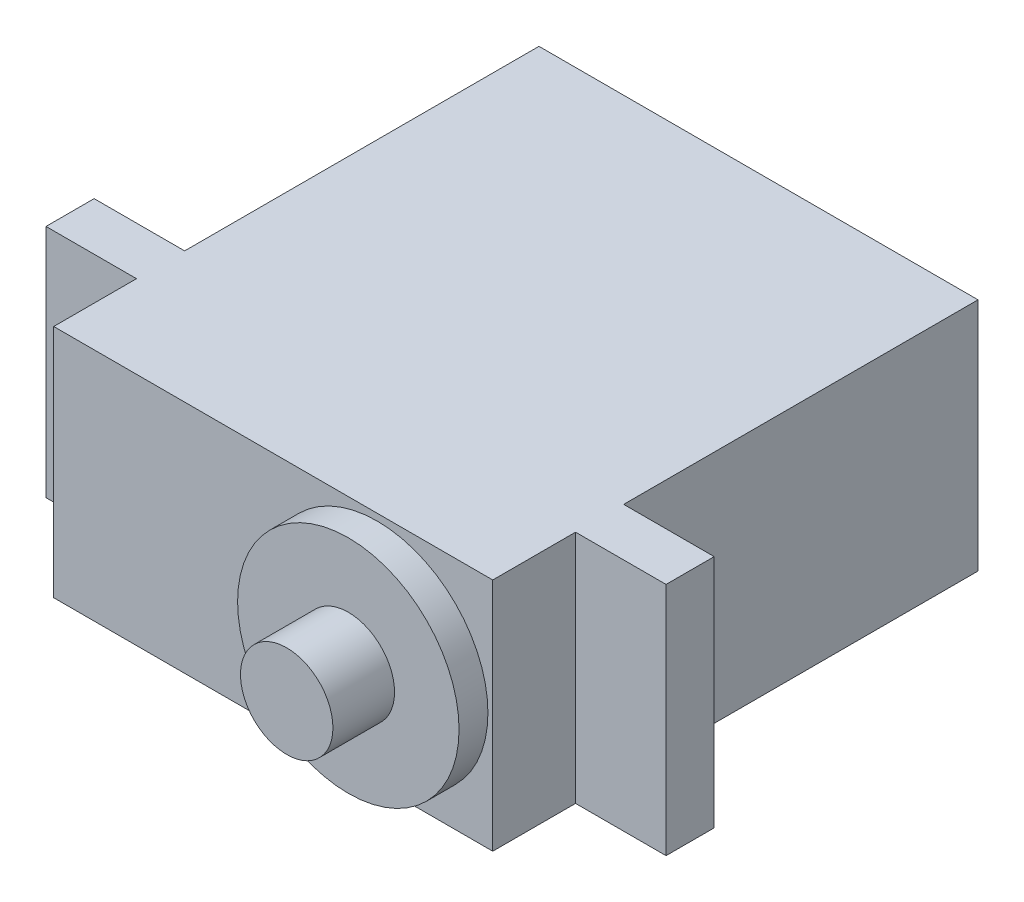
ISO-10303-21;
HEADER;
FILE_DESCRIPTION(('STEP AP214'),'2;1');
FILE_NAME('part.step','',(''),(''),'','','');
FILE_SCHEMA(('AUTOMOTIVE_DESIGN { 1 0 10303 214 1 1 1 1 }'));
ENDSEC;
DATA;
#1=APPLICATION_CONTEXT('core data for automotive mechanical design processes');
#2=APPLICATION_PROTOCOL_DEFINITION('international standard','automotive_design',2000,#1);
#3=PRODUCT_CONTEXT('',#1,'mechanical');
#4=PRODUCT('Part','Part','',(#3));
#5=PRODUCT_RELATED_PRODUCT_CATEGORY('part','',(#4));
#6=PRODUCT_DEFINITION_FORMATION('','',#4);
#7=PRODUCT_DEFINITION_CONTEXT('part definition',#1,'design');
#8=PRODUCT_DEFINITION('design','',#6,#7);
#9=PRODUCT_DEFINITION_SHAPE('','',#8);
#10=(LENGTH_UNIT() NAMED_UNIT(*) SI_UNIT(.MILLI.,.METRE.));
#11=(NAMED_UNIT(*) PLANE_ANGLE_UNIT() SI_UNIT($,.RADIAN.));
#12=(NAMED_UNIT(*) SI_UNIT($,.STERADIAN.) SOLID_ANGLE_UNIT());
#13=UNCERTAINTY_MEASURE_WITH_UNIT(LENGTH_MEASURE(1.E-05),#10,'distance_accuracy_value','');
#14=(GEOMETRIC_REPRESENTATION_CONTEXT(3) GLOBAL_UNCERTAINTY_ASSIGNED_CONTEXT((#13)) GLOBAL_UNIT_ASSIGNED_CONTEXT((#10,
#11,#12)) REPRESENTATION_CONTEXT('',''));
#15=CARTESIAN_POINT('',(0.,0.,0.));
#16=DIRECTION('',(0.,0.,1.));
#17=DIRECTION('',(1.,0.,0.));
#18=AXIS2_PLACEMENT_3D('',#15,#16,#17);
#19=CARTESIAN_POINT('',(0.,0.,9.));
#20=DIRECTION('',(0.,0.,1.));
#21=DIRECTION('',(1.,0.,0.));
#22=AXIS2_PLACEMENT_3D('',#19,#20,#21);
#23=PLANE('',#22);
#24=CARTESIAN_POINT('',(0.,0.,9.));
#25=DIRECTION('',(0.,0.,1.));
#26=DIRECTION('',(1.,0.,0.));
#27=AXIS2_PLACEMENT_3D('',#24,#25,#26);
#28=CIRCLE('',#27,2.4);
#29=CARTESIAN_POINT('',(2.4,0.,9.));
#30=VERTEX_POINT('',#29);
#31=EDGE_CURVE('E9',#30,#30,#28,.T.);
#32=ORIENTED_EDGE('',*,*,#31,.T.);
#33=EDGE_LOOP('',(#32));
#34=FACE_BOUND('',#33,.T.);
#35=ADVANCED_FACE('F15',(#34),#23,.T.);
#36=CARTESIAN_POINT('',(0.,0.,4.3));
#37=DIRECTION('',(0.,0.,-1.));
#38=DIRECTION('',(1.,0.,0.));
#39=AXIS2_PLACEMENT_3D('',#36,#37,#38);
#40=CYLINDRICAL_SURFACE('',#39,2.4);
#41=DIRECTION('',(0.,0.,1.));
#42=VECTOR('',#41,1.);
#43=CARTESIAN_POINT('',(2.4,0.,4.3));
#44=LINE('',#43,#42);
#45=CARTESIAN_POINT('',(2.4,0.,5.8));
#46=VERTEX_POINT('',#45);
#47=EDGE_CURVE('E23',#46,#30,#44,.T.);
#48=ORIENTED_EDGE('',*,*,#47,.T.);
#49=ORIENTED_EDGE('',*,*,#31,.F.);
#50=ORIENTED_EDGE('',*,*,#47,.F.);
#51=CARTESIAN_POINT('',(0.,0.,5.8));
#52=DIRECTION('',(0.,0.,-1.));
#53=DIRECTION('',(1.,0.,0.));
#54=AXIS2_PLACEMENT_3D('',#51,#52,#53);
#55=CIRCLE('',#54,2.4);
#56=EDGE_CURVE('E304',#46,#46,#55,.T.);
#57=ORIENTED_EDGE('',*,*,#56,.F.);
#58=EDGE_LOOP('',(#48,#49,#50,#57));
#59=FACE_BOUND('',#58,.T.);
#60=ADVANCED_FACE('F307',(#59),#40,.T.);
#61=CARTESIAN_POINT('',(0.,0.,5.8));
#62=DIRECTION('',(0.,0.,1.));
#63=DIRECTION('',(1.,0.,0.));
#64=AXIS2_PLACEMENT_3D('',#61,#62,#63);
#65=PLANE('',#64);
#66=ORIENTED_EDGE('',*,*,#56,.T.);
#67=EDGE_LOOP('',(#66));
#68=FACE_BOUND('',#67,.T.);
#69=CARTESIAN_POINT('',(0.,0.,5.8));
#70=DIRECTION('',(0.,0.,1.));
#71=DIRECTION('',(1.,0.,0.));
#72=AXIS2_PLACEMENT_3D('',#69,#70,#71);
#73=CIRCLE('',#72,5.75);
#74=CARTESIAN_POINT('',(5.75,0.,5.8));
#75=VERTEX_POINT('',#74);
#76=EDGE_CURVE('E299',#75,#75,#73,.T.);
#77=ORIENTED_EDGE('',*,*,#76,.T.);
#78=EDGE_LOOP('',(#77));
#79=FACE_BOUND('',#78,.T.);
#80=ADVANCED_FACE('F310',(#68,#79),#65,.T.);
#81=CARTESIAN_POINT('',(0.,0.,4.3));
#82=DIRECTION('',(0.,0.,-1.));
#83=DIRECTION('',(1.,0.,0.));
#84=AXIS2_PLACEMENT_3D('',#81,#82,#83);
#85=CYLINDRICAL_SURFACE('',#84,5.75);
#86=CARTESIAN_POINT('',(0.,0.,4.3));
#87=DIRECTION('',(0.,0.,1.));
#88=DIRECTION('',(1.,0.,0.));
#89=AXIS2_PLACEMENT_3D('',#86,#87,#88);
#90=CIRCLE('',#89,5.75);
#91=CARTESIAN_POINT('',(5.75,0.,4.3));
#92=VERTEX_POINT('',#91);
#93=EDGE_CURVE('E284',#92,#92,#90,.T.);
#94=ORIENTED_EDGE('',*,*,#93,.T.);
#95=DIRECTION('',(0.,0.,1.));
#96=VECTOR('',#95,1.);
#97=CARTESIAN_POINT('',(5.75,0.,4.3));
#98=LINE('',#97,#96);
#99=EDGE_CURVE('E296',#92,#75,#98,.T.);
#100=ORIENTED_EDGE('',*,*,#99,.T.);
#101=ORIENTED_EDGE('',*,*,#76,.F.);
#102=ORIENTED_EDGE('',*,*,#99,.F.);
#103=EDGE_LOOP('',(#94,#100,#101,#102));
#104=FACE_BOUND('',#103,.T.);
#105=ADVANCED_FACE('F315',(#104),#85,.T.);
#106=CARTESIAN_POINT('',(-21.5,-6.1,-2.5));
#107=DIRECTION('',(0.,0.,1.));
#108=DIRECTION('',(1.,0.,0.));
#109=AXIS2_PLACEMENT_3D('',#106,#107,#108);
#110=PLANE('',#109);
#111=DIRECTION('',(0.,1.,0.));
#112=VECTOR('',#111,1.);
#113=CARTESIAN_POINT('',(10.7,-6.1,-2.5));
#114=LINE('',#113,#112);
#115=CARTESIAN_POINT('',(10.7,-6.1,-2.5));
#116=VERTEX_POINT('',#115);
#117=CARTESIAN_POINT('',(10.7,6.1,-2.5));
#118=VERTEX_POINT('',#117);
#119=EDGE_CURVE('E293',#116,#118,#114,.T.);
#120=ORIENTED_EDGE('',*,*,#119,.F.);
#121=DIRECTION('',(1.,0.,0.));
#122=VECTOR('',#121,1.);
#123=CARTESIAN_POINT('',(-21.5,-6.1,-2.5));
#124=LINE('',#123,#122);
#125=CARTESIAN_POINT('',(6.,-6.1,-2.5));
#126=VERTEX_POINT('',#125);
#127=EDGE_CURVE('E194',#126,#116,#124,.T.);
#128=ORIENTED_EDGE('',*,*,#127,.F.);
#129=DIRECTION('',(0.,-1.,0.));
#130=VECTOR('',#129,1.);
#131=CARTESIAN_POINT('',(6.,-6.1,-2.5));
#132=LINE('',#131,#130);
#133=CARTESIAN_POINT('',(6.,6.1,-2.5));
#134=VERTEX_POINT('',#133);
#135=EDGE_CURVE('E268',#134,#126,#132,.T.);
#136=ORIENTED_EDGE('',*,*,#135,.F.);
#137=DIRECTION('',(1.,0.,0.));
#138=VECTOR('',#137,1.);
#139=CARTESIAN_POINT('',(-21.5,6.1,-2.5));
#140=LINE('',#139,#138);
#141=EDGE_CURVE('E261',#134,#118,#140,.T.);
#142=ORIENTED_EDGE('',*,*,#141,.T.);
#143=EDGE_LOOP('',(#120,#128,#136,#142));
#144=FACE_BOUND('',#143,.T.);
#145=ADVANCED_FACE('F370',(#144),#110,.F.);
#146=CARTESIAN_POINT('',(10.7,-6.1,-2.5));
#147=DIRECTION('',(1.,0.,0.));
#148=DIRECTION('',(0.,1.,0.));
#149=AXIS2_PLACEMENT_3D('',#146,#147,#148);
#150=PLANE('',#149);
#151=DIRECTION('',(0.,0.,1.));
#152=VECTOR('',#151,1.);
#153=CARTESIAN_POINT('',(10.7,-6.1,-2.5));
#154=LINE('',#153,#152);
#155=CARTESIAN_POINT('',(10.7,-6.1,0.));
#156=VERTEX_POINT('',#155);
#157=EDGE_CURVE('E201',#116,#156,#154,.T.);
#158=ORIENTED_EDGE('',*,*,#157,.F.);
#159=ORIENTED_EDGE('',*,*,#119,.T.);
#160=DIRECTION('',(0.,0.,1.));
#161=VECTOR('',#160,1.);
#162=CARTESIAN_POINT('',(10.7,6.1,-2.5));
#163=LINE('',#162,#161);
#164=CARTESIAN_POINT('',(10.7,6.1,0.));
#165=VERTEX_POINT('',#164);
#166=EDGE_CURVE('E260',#118,#165,#163,.T.);
#167=ORIENTED_EDGE('',*,*,#166,.T.);
#168=DIRECTION('',(0.,1.,0.));
#169=VECTOR('',#168,1.);
#170=CARTESIAN_POINT('',(10.7,-6.1,0.));
#171=LINE('',#170,#169);
#172=EDGE_CURVE('E289',#156,#165,#171,.T.);
#173=ORIENTED_EDGE('',*,*,#172,.F.);
#174=EDGE_LOOP('',(#158,#159,#167,#173));
#175=FACE_BOUND('',#174,.T.);
#176=ADVANCED_FACE('F361',(#175),#150,.T.);
#177=CARTESIAN_POINT('',(-21.5,-6.1,0.));
#178=DIRECTION('',(0.,0.,1.));
#179=DIRECTION('',(1.,0.,0.));
#180=AXIS2_PLACEMENT_3D('',#177,#178,#179);
#181=PLANE('',#180);
#182=DIRECTION('',(1.,0.,0.));
#183=VECTOR('',#182,1.);
#184=CARTESIAN_POINT('',(-21.5,6.1,0.));
#185=LINE('',#184,#183);
#186=CARTESIAN_POINT('',(6.,6.1,0.));
#187=VERTEX_POINT('',#186);
#188=EDGE_CURVE('E251',#187,#165,#185,.T.);
#189=ORIENTED_EDGE('',*,*,#188,.F.);
#190=DIRECTION('',(0.,-1.,0.));
#191=VECTOR('',#190,1.);
#192=CARTESIAN_POINT('',(6.,-6.1,0.));
#193=LINE('',#192,#191);
#194=CARTESIAN_POINT('',(6.,-6.1,0.));
#195=VERTEX_POINT('',#194);
#196=EDGE_CURVE('E290',#187,#195,#193,.T.);
#197=ORIENTED_EDGE('',*,*,#196,.T.);
#198=DIRECTION('',(1.,0.,0.));
#199=VECTOR('',#198,1.);
#200=CARTESIAN_POINT('',(-21.5,-6.1,0.));
#201=LINE('',#200,#199);
#202=EDGE_CURVE('E211',#195,#156,#201,.T.);
#203=ORIENTED_EDGE('',*,*,#202,.T.);
#204=ORIENTED_EDGE('',*,*,#172,.T.);
#205=EDGE_LOOP('',(#189,#197,#203,#204));
#206=FACE_BOUND('',#205,.T.);
#207=ADVANCED_FACE('F368',(#206),#181,.T.);
#208=CARTESIAN_POINT('',(6.,-6.1,-20.9));
#209=DIRECTION('',(1.,0.,0.));
#210=DIRECTION('',(0.,1.,0.));
#211=AXIS2_PLACEMENT_3D('',#208,#209,#210);
#212=PLANE('',#211);
#213=DIRECTION('',(0.,0.,1.));
#214=VECTOR('',#213,1.);
#215=CARTESIAN_POINT('',(6.,-6.1,-20.9));
#216=LINE('',#215,#214);
#217=CARTESIAN_POINT('',(6.,-6.1,4.3));
#218=VERTEX_POINT('',#217);
#219=EDGE_CURVE('E190',#195,#218,#216,.T.);
#220=ORIENTED_EDGE('',*,*,#219,.F.);
#221=ORIENTED_EDGE('',*,*,#196,.F.);
#222=DIRECTION('',(0.,0.,1.));
#223=VECTOR('',#222,1.);
#224=CARTESIAN_POINT('',(6.,6.1,-20.9));
#225=LINE('',#224,#223);
#226=CARTESIAN_POINT('',(6.,6.1,4.3));
#227=VERTEX_POINT('',#226);
#228=EDGE_CURVE('E246',#187,#227,#225,.T.);
#229=ORIENTED_EDGE('',*,*,#228,.T.);
#230=DIRECTION('',(0.,1.,0.));
#231=VECTOR('',#230,1.);
#232=CARTESIAN_POINT('',(6.,-6.1,4.3));
#233=LINE('',#232,#231);
#234=EDGE_CURVE('E278',#218,#227,#233,.T.);
#235=ORIENTED_EDGE('',*,*,#234,.F.);
#236=EDGE_LOOP('',(#220,#221,#229,#235));
#237=FACE_BOUND('',#236,.T.);
#238=ADVANCED_FACE('F325',(#237),#212,.T.);
#239=CARTESIAN_POINT('',(-16.8,-6.1,4.3));
#240=DIRECTION('',(0.,0.,1.));
#241=DIRECTION('',(1.,0.,0.));
#242=AXIS2_PLACEMENT_3D('',#239,#240,#241);
#243=PLANE('',#242);
#244=ORIENTED_EDGE('',*,*,#93,.F.);
#245=EDGE_LOOP('',(#244));
#246=FACE_BOUND('',#245,.T.);
#247=DIRECTION('',(0.,1.,0.));
#248=VECTOR('',#247,1.);
#249=CARTESIAN_POINT('',(-16.8,-6.1,4.3));
#250=LINE('',#249,#248);
#251=CARTESIAN_POINT('',(-16.8,-6.1,4.3));
#252=VERTEX_POINT('',#251);
#253=CARTESIAN_POINT('',(-16.8,6.1,4.3));
#254=VERTEX_POINT('',#253);
#255=EDGE_CURVE('E280',#252,#254,#250,.T.);
#256=ORIENTED_EDGE('',*,*,#255,.F.);
#257=DIRECTION('',(1.,0.,0.));
#258=VECTOR('',#257,1.);
#259=CARTESIAN_POINT('',(-16.8,-6.1,4.3));
#260=LINE('',#259,#258);
#261=EDGE_CURVE('E183',#252,#218,#260,.T.);
#262=ORIENTED_EDGE('',*,*,#261,.T.);
#263=ORIENTED_EDGE('',*,*,#234,.T.);
#264=DIRECTION('',(1.,0.,0.));
#265=VECTOR('',#264,1.);
#266=CARTESIAN_POINT('',(-16.8,6.1,4.3));
#267=LINE('',#266,#265);
#268=EDGE_CURVE('E244',#254,#227,#267,.T.);
#269=ORIENTED_EDGE('',*,*,#268,.F.);
#270=EDGE_LOOP('',(#256,#262,#263,#269));
#271=FACE_BOUND('',#270,.T.);
#272=ADVANCED_FACE('F318',(#246,#271),#243,.T.);
#273=CARTESIAN_POINT('',(-16.8,-6.1,-20.9));
#274=DIRECTION('',(1.,0.,0.));
#275=DIRECTION('',(0.,1.,0.));
#276=AXIS2_PLACEMENT_3D('',#273,#274,#275);
#277=PLANE('',#276);
#278=ORIENTED_EDGE('',*,*,#255,.T.);
#279=DIRECTION('',(0.,0.,1.));
#280=VECTOR('',#279,1.);
#281=CARTESIAN_POINT('',(-16.8,6.1,-20.9));
#282=LINE('',#281,#280);
#283=CARTESIAN_POINT('',(-16.8,6.1,0.));
#284=VERTEX_POINT('',#283);
#285=EDGE_CURVE('E241',#284,#254,#282,.T.);
#286=ORIENTED_EDGE('',*,*,#285,.F.);
#287=DIRECTION('',(0.,-1.,0.));
#288=VECTOR('',#287,1.);
#289=CARTESIAN_POINT('',(-16.8,-6.1,0.));
#290=LINE('',#289,#288);
#291=CARTESIAN_POINT('',(-16.8,-6.1,0.));
#292=VERTEX_POINT('',#291);
#293=EDGE_CURVE('E273',#284,#292,#290,.T.);
#294=ORIENTED_EDGE('',*,*,#293,.T.);
#295=DIRECTION('',(0.,0.,1.));
#296=VECTOR('',#295,1.);
#297=CARTESIAN_POINT('',(-16.8,-6.1,-20.9));
#298=LINE('',#297,#296);
#299=EDGE_CURVE('E186',#292,#252,#298,.T.);
#300=ORIENTED_EDGE('',*,*,#299,.T.);
#301=EDGE_LOOP('',(#278,#286,#294,#300));
#302=FACE_BOUND('',#301,.T.);
#303=ADVANCED_FACE('F321',(#302),#277,.F.);
#304=CARTESIAN_POINT('',(-21.5,-6.1,0.));
#305=DIRECTION('',(0.,0.,1.));
#306=DIRECTION('',(1.,0.,0.));
#307=AXIS2_PLACEMENT_3D('',#304,#305,#306);
#308=PLANE('',#307);
#309=DIRECTION('',(1.,0.,0.));
#310=VECTOR('',#309,1.);
#311=CARTESIAN_POINT('',(-21.5,6.1,0.));
#312=LINE('',#311,#310);
#313=CARTESIAN_POINT('',(-21.5,6.1,0.));
#314=VERTEX_POINT('',#313);
#315=EDGE_CURVE('E236',#314,#284,#312,.T.);
#316=ORIENTED_EDGE('',*,*,#315,.F.);
#317=DIRECTION('',(0.,1.,0.));
#318=VECTOR('',#317,1.);
#319=CARTESIAN_POINT('',(-21.5,-6.1,0.));
#320=LINE('',#319,#318);
#321=CARTESIAN_POINT('',(-21.5,-6.1,0.));
#322=VERTEX_POINT('',#321);
#323=EDGE_CURVE('E271',#322,#314,#320,.T.);
#324=ORIENTED_EDGE('',*,*,#323,.F.);
#325=DIRECTION('',(1.,0.,0.));
#326=VECTOR('',#325,1.);
#327=CARTESIAN_POINT('',(-21.5,-6.1,0.));
#328=LINE('',#327,#326);
#329=EDGE_CURVE('E200',#322,#292,#328,.T.);
#330=ORIENTED_EDGE('',*,*,#329,.T.);
#331=ORIENTED_EDGE('',*,*,#293,.F.);
#332=EDGE_LOOP('',(#316,#324,#330,#331));
#333=FACE_BOUND('',#332,.T.);
#334=ADVANCED_FACE('F338',(#333),#308,.T.);
#335=CARTESIAN_POINT('',(-21.5,-6.1,-2.5));
#336=DIRECTION('',(1.,0.,0.));
#337=DIRECTION('',(0.,1.,0.));
#338=AXIS2_PLACEMENT_3D('',#335,#336,#337);
#339=PLANE('',#338);
#340=ORIENTED_EDGE('',*,*,#323,.T.);
#341=DIRECTION('',(0.,0.,1.));
#342=VECTOR('',#341,1.);
#343=CARTESIAN_POINT('',(-21.5,6.1,-2.5));
#344=LINE('',#343,#342);
#345=CARTESIAN_POINT('',(-21.5,6.1,-2.5));
#346=VERTEX_POINT('',#345);
#347=EDGE_CURVE('E232',#346,#314,#344,.T.);
#348=ORIENTED_EDGE('',*,*,#347,.F.);
#349=DIRECTION('',(0.,1.,0.));
#350=VECTOR('',#349,1.);
#351=CARTESIAN_POINT('',(-21.5,-6.1,-2.5));
#352=LINE('',#351,#350);
#353=CARTESIAN_POINT('',(-21.5,-6.1,-2.5));
#354=VERTEX_POINT('',#353);
#355=EDGE_CURVE('E152',#354,#346,#352,.T.);
#356=ORIENTED_EDGE('',*,*,#355,.F.);
#357=DIRECTION('',(0.,0.,1.));
#358=VECTOR('',#357,1.);
#359=CARTESIAN_POINT('',(-21.5,-6.1,-2.5));
#360=LINE('',#359,#358);
#361=EDGE_CURVE('E191',#354,#322,#360,.T.);
#362=ORIENTED_EDGE('',*,*,#361,.T.);
#363=EDGE_LOOP('',(#340,#348,#356,#362));
#364=FACE_BOUND('',#363,.T.);
#365=ADVANCED_FACE('F345',(#364),#339,.F.);
#366=CARTESIAN_POINT('',(6.,-6.1,-20.9));
#367=DIRECTION('',(1.,0.,0.));
#368=DIRECTION('',(0.,1.,0.));
#369=AXIS2_PLACEMENT_3D('',#366,#367,#368);
#370=PLANE('',#369);
#371=DIRECTION('',(0.,0.,1.));
#372=VECTOR('',#371,1.);
#373=CARTESIAN_POINT('',(6.,-6.1,-20.9));
#374=LINE('',#373,#372);
#375=CARTESIAN_POINT('',(6.,-6.1,-20.9));
#376=VERTEX_POINT('',#375);
#377=EDGE_CURVE('E181',#376,#126,#374,.T.);
#378=ORIENTED_EDGE('',*,*,#377,.F.);
#379=DIRECTION('',(0.,1.,0.));
#380=VECTOR('',#379,1.);
#381=CARTESIAN_POINT('',(6.,-6.1,-20.9));
#382=LINE('',#381,#380);
#383=CARTESIAN_POINT('',(6.,6.1,-20.9));
#384=VERTEX_POINT('',#383);
#385=EDGE_CURVE('E264',#376,#384,#382,.T.);
#386=ORIENTED_EDGE('',*,*,#385,.T.);
#387=DIRECTION('',(0.,0.,1.));
#388=VECTOR('',#387,1.);
#389=CARTESIAN_POINT('',(6.,6.1,-20.9));
#390=LINE('',#389,#388);
#391=EDGE_CURVE('E158',#384,#134,#390,.T.);
#392=ORIENTED_EDGE('',*,*,#391,.T.);
#393=ORIENTED_EDGE('',*,*,#135,.T.);
#394=EDGE_LOOP('',(#378,#386,#392,#393));
#395=FACE_BOUND('',#394,.T.);
#396=ADVANCED_FACE('F342',(#395),#370,.T.);
#397=CARTESIAN_POINT('',(-16.8,-6.1,-20.9));
#398=DIRECTION('',(0.,0.,1.));
#399=DIRECTION('',(1.,0.,0.));
#400=AXIS2_PLACEMENT_3D('',#397,#398,#399);
#401=PLANE('',#400);
#402=DIRECTION('',(1.,0.,0.));
#403=VECTOR('',#402,1.);
#404=CARTESIAN_POINT('',(-16.8,6.1,-20.9));
#405=LINE('',#404,#403);
#406=CARTESIAN_POINT('',(-16.8,6.1,-20.9));
#407=VERTEX_POINT('',#406);
#408=EDGE_CURVE('E164',#407,#384,#405,.T.);
#409=ORIENTED_EDGE('',*,*,#408,.T.);
#410=ORIENTED_EDGE('',*,*,#385,.F.);
#411=DIRECTION('',(1.,0.,0.));
#412=VECTOR('',#411,1.);
#413=CARTESIAN_POINT('',(-16.8,-6.1,-20.9));
#414=LINE('',#413,#412);
#415=CARTESIAN_POINT('',(-16.8,-6.1,-20.9));
#416=VERTEX_POINT('',#415);
#417=EDGE_CURVE('E210',#416,#376,#414,.T.);
#418=ORIENTED_EDGE('',*,*,#417,.F.);
#419=DIRECTION('',(0.,1.,0.));
#420=VECTOR('',#419,1.);
#421=CARTESIAN_POINT('',(-16.8,-6.1,-20.9));
#422=LINE('',#421,#420);
#423=EDGE_CURVE('E168',#416,#407,#422,.T.);
#424=ORIENTED_EDGE('',*,*,#423,.T.);
#425=EDGE_LOOP('',(#409,#410,#418,#424));
#426=FACE_BOUND('',#425,.T.);
#427=ADVANCED_FACE('F351',(#426),#401,.F.);
#428=CARTESIAN_POINT('',(-16.8,6.1,-20.9));
#429=DIRECTION('',(0.,1.,0.));
#430=DIRECTION('',(1.,0.,0.));
#431=AXIS2_PLACEMENT_3D('',#428,#429,#430);
#432=PLANE('',#431);
#433=ORIENTED_EDGE('',*,*,#391,.F.);
#434=ORIENTED_EDGE('',*,*,#408,.F.);
#435=DIRECTION('',(0.,0.,1.));
#436=VECTOR('',#435,1.);
#437=CARTESIAN_POINT('',(-16.8,6.1,-20.9));
#438=LINE('',#437,#436);
#439=CARTESIAN_POINT('',(-16.8,6.1,-2.5));
#440=VERTEX_POINT('',#439);
#441=EDGE_CURVE('E161',#407,#440,#438,.T.);
#442=ORIENTED_EDGE('',*,*,#441,.T.);
#443=DIRECTION('',(1.,0.,0.));
#444=VECTOR('',#443,1.);
#445=CARTESIAN_POINT('',(-21.5,6.1,-2.5));
#446=LINE('',#445,#444);
#447=EDGE_CURVE('E146',#346,#440,#446,.T.);
#448=ORIENTED_EDGE('',*,*,#447,.F.);
#449=ORIENTED_EDGE('',*,*,#347,.T.);
#450=ORIENTED_EDGE('',*,*,#315,.T.);
#451=ORIENTED_EDGE('',*,*,#285,.T.);
#452=ORIENTED_EDGE('',*,*,#268,.T.);
#453=ORIENTED_EDGE('',*,*,#228,.F.);
#454=ORIENTED_EDGE('',*,*,#188,.T.);
#455=ORIENTED_EDGE('',*,*,#166,.F.);
#456=ORIENTED_EDGE('',*,*,#141,.F.);
#457=EDGE_LOOP('',(#433,#434,#442,#448,#449,#450,#451,#452,#453,#454,#455,#456));
#458=FACE_BOUND('',#457,.T.);
#459=ADVANCED_FACE('F162',(#458),#432,.T.);
#460=CARTESIAN_POINT('',(-21.5,-6.1,-2.5));
#461=DIRECTION('',(0.,0.,1.));
#462=DIRECTION('',(1.,0.,0.));
#463=AXIS2_PLACEMENT_3D('',#460,#461,#462);
#464=PLANE('',#463);
#465=DIRECTION('',(0.,-1.,0.));
#466=VECTOR('',#465,1.);
#467=CARTESIAN_POINT('',(-16.8,-6.1,-2.5));
#468=LINE('',#467,#466);
#469=CARTESIAN_POINT('',(-16.8,-6.1,-2.5));
#470=VERTEX_POINT('',#469);
#471=EDGE_CURVE('E153',#440,#470,#468,.T.);
#472=ORIENTED_EDGE('',*,*,#471,.T.);
#473=DIRECTION('',(1.,0.,0.));
#474=VECTOR('',#473,1.);
#475=CARTESIAN_POINT('',(-21.5,-6.1,-2.5));
#476=LINE('',#475,#474);
#477=EDGE_CURVE('E196',#354,#470,#476,.T.);
#478=ORIENTED_EDGE('',*,*,#477,.F.);
#479=ORIENTED_EDGE('',*,*,#355,.T.);
#480=ORIENTED_EDGE('',*,*,#447,.T.);
#481=EDGE_LOOP('',(#472,#478,#479,#480));
#482=FACE_BOUND('',#481,.T.);
#483=ADVANCED_FACE('F147',(#482),#464,.F.);
#484=CARTESIAN_POINT('',(-16.8,-6.1,-20.9));
#485=DIRECTION('',(0.,1.,0.));
#486=DIRECTION('',(1.,0.,0.));
#487=AXIS2_PLACEMENT_3D('',#484,#485,#486);
#488=PLANE('',#487);
#489=ORIENTED_EDGE('',*,*,#127,.T.);
#490=ORIENTED_EDGE('',*,*,#157,.T.);
#491=ORIENTED_EDGE('',*,*,#202,.F.);
#492=ORIENTED_EDGE('',*,*,#219,.T.);
#493=ORIENTED_EDGE('',*,*,#261,.F.);
#494=ORIENTED_EDGE('',*,*,#299,.F.);
#495=ORIENTED_EDGE('',*,*,#329,.F.);
#496=ORIENTED_EDGE('',*,*,#361,.F.);
#497=ORIENTED_EDGE('',*,*,#477,.T.);
#498=DIRECTION('',(0.,0.,1.));
#499=VECTOR('',#498,1.);
#500=CARTESIAN_POINT('',(-16.8,-6.1,-20.9));
#501=LINE('',#500,#499);
#502=EDGE_CURVE('E175',#416,#470,#501,.T.);
#503=ORIENTED_EDGE('',*,*,#502,.F.);
#504=ORIENTED_EDGE('',*,*,#417,.T.);
#505=ORIENTED_EDGE('',*,*,#377,.T.);
#506=EDGE_LOOP('',(#489,#490,#491,#492,#493,#494,#495,#496,#497,#503,#504,#505));
#507=FACE_BOUND('',#506,.T.);
#508=ADVANCED_FACE('F332',(#507),#488,.F.);
#509=CARTESIAN_POINT('',(-16.8,-6.1,-20.9));
#510=DIRECTION('',(1.,0.,0.));
#511=DIRECTION('',(0.,1.,0.));
#512=AXIS2_PLACEMENT_3D('',#509,#510,#511);
#513=PLANE('',#512);
#514=ORIENTED_EDGE('',*,*,#471,.F.);
#515=ORIENTED_EDGE('',*,*,#441,.F.);
#516=ORIENTED_EDGE('',*,*,#423,.F.);
#517=ORIENTED_EDGE('',*,*,#502,.T.);
#518=EDGE_LOOP('',(#514,#515,#516,#517));
#519=FACE_BOUND('',#518,.T.);
#520=ADVANCED_FACE('F174',(#519),#513,.F.);
#521=CLOSED_SHELL('',(#35,#60,#80,#105,#145,#176,#207,#238,#272,#303,#334,#365,#396,#427,#459,
#483,#508,#520));
#522=MANIFOLD_SOLID_BREP('B1',#521);
#523=ADVANCED_BREP_SHAPE_REPRESENTATION('',(#18,#522),#14);
#524=SHAPE_DEFINITION_REPRESENTATION(#9,#523);
ENDSEC;
END-ISO-10303-21;
